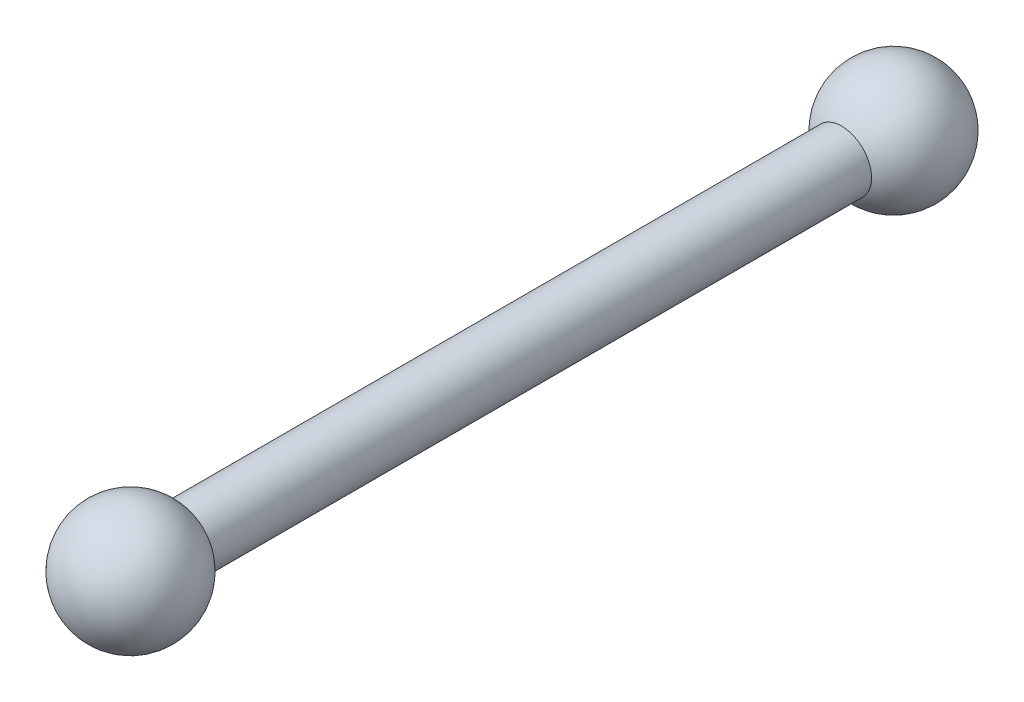
ISO-10303-21;
HEADER;
FILE_DESCRIPTION(('STEP AP214'),'2;1');
FILE_NAME('part.step','',(''),(''),'','','');
FILE_SCHEMA(('AUTOMOTIVE_DESIGN { 1 0 10303 214 1 1 1 1 }'));
ENDSEC;
DATA;
#1=APPLICATION_CONTEXT('core data for automotive mechanical design processes');
#2=APPLICATION_PROTOCOL_DEFINITION('international standard','automotive_design',2000,#1);
#3=PRODUCT_CONTEXT('',#1,'mechanical');
#4=PRODUCT('Part','Part','',(#3));
#5=PRODUCT_RELATED_PRODUCT_CATEGORY('part','',(#4));
#6=PRODUCT_DEFINITION_FORMATION('','',#4);
#7=PRODUCT_DEFINITION_CONTEXT('part definition',#1,'design');
#8=PRODUCT_DEFINITION('design','',#6,#7);
#9=PRODUCT_DEFINITION_SHAPE('','',#8);
#10=(LENGTH_UNIT() NAMED_UNIT(*) SI_UNIT(.MILLI.,.METRE.));
#11=(NAMED_UNIT(*) PLANE_ANGLE_UNIT() SI_UNIT($,.RADIAN.));
#12=(NAMED_UNIT(*) SI_UNIT($,.STERADIAN.) SOLID_ANGLE_UNIT());
#13=UNCERTAINTY_MEASURE_WITH_UNIT(LENGTH_MEASURE(1.E-05),#10,'distance_accuracy_value','');
#14=(GEOMETRIC_REPRESENTATION_CONTEXT(3) GLOBAL_UNCERTAINTY_ASSIGNED_CONTEXT((#13)) GLOBAL_UNIT_ASSIGNED_CONTEXT((#10,
#11,#12)) REPRESENTATION_CONTEXT('',''));
#15=CARTESIAN_POINT('',(0.,0.,0.));
#16=DIRECTION('',(0.,0.,1.));
#17=DIRECTION('',(1.,0.,0.));
#18=AXIS2_PLACEMENT_3D('',#15,#16,#17);
#19=CARTESIAN_POINT('',(0.,0.,-48.));
#20=DIRECTION('',(0.,1.,0.));
#21=DIRECTION('',(1.,0.,0.));
#22=AXIS2_PLACEMENT_3D('',#19,#20,#21);
#23=SPHERICAL_SURFACE('',#22,4.);
#24=CARTESIAN_POINT('',(0.,0.,-48.));
#25=DIRECTION('',(0.,0.,-1.));
#26=DIRECTION('',(-1.,0.,0.));
#27=AXIS2_PLACEMENT_3D('',#24,#25,#26);
#28=SPHERICAL_SURFACE('',#27,4.);
#29=CARTESIAN_POINT('',(0.,0.,-44.5358983848622));
#30=DIRECTION('',(0.,0.,-1.));
#31=DIRECTION('',(-1.,0.,0.));
#32=AXIS2_PLACEMENT_3D('',#29,#30,#31);
#33=CIRCLE('',#32,2.);
#34=CARTESIAN_POINT('',(-2.,0.,-44.5358983848622));
#35=VERTEX_POINT('',#34);
#36=EDGE_CURVE('E37',#35,#35,#33,.F.);
#37=ORIENTED_EDGE('',*,*,#36,.F.);
#38=EDGE_LOOP('',(#37));
#39=FACE_BOUND('',#38,.T.);
#40=ADVANCED_FACE('F33',(#39),#28,.T.);
#41=CARTESIAN_POINT('',(0.,0.,-45.));
#42=DIRECTION('',(0.,0.,1.));
#43=DIRECTION('',(1.,0.,0.));
#44=AXIS2_PLACEMENT_3D('',#41,#42,#43);
#45=CYLINDRICAL_SURFACE('',#44,2.);
#46=CARTESIAN_POINT('',(0.,0.,-0.464101615137766));
#47=DIRECTION('',(0.,0.,1.));
#48=DIRECTION('',(1.,0.,0.));
#49=AXIS2_PLACEMENT_3D('',#46,#47,#48);
#50=CIRCLE('',#49,2.);
#51=CARTESIAN_POINT('',(2.,0.,-0.464101615137766));
#52=VERTEX_POINT('',#51);
#53=EDGE_CURVE('E10',#52,#52,#50,.F.);
#54=ORIENTED_EDGE('',*,*,#53,.T.);
#55=EDGE_LOOP('',(#54));
#56=FACE_BOUND('',#55,.T.);
#57=ORIENTED_EDGE('',*,*,#36,.T.);
#58=EDGE_LOOP('',(#57));
#59=FACE_BOUND('',#58,.T.);
#60=ADVANCED_FACE('F35',(#56,#59),#45,.T.);
#61=CARTESIAN_POINT('',(0.,0.,3.));
#62=DIRECTION('',(0.,1.,0.));
#63=DIRECTION('',(1.,0.,0.));
#64=AXIS2_PLACEMENT_3D('',#61,#62,#63);
#65=SPHERICAL_SURFACE('',#64,4.);
#66=CARTESIAN_POINT('',(0.,0.,3.));
#67=DIRECTION('',(0.,0.,1.));
#68=DIRECTION('',(1.,0.,0.));
#69=AXIS2_PLACEMENT_3D('',#66,#67,#68);
#70=SPHERICAL_SURFACE('',#69,4.);
#71=ORIENTED_EDGE('',*,*,#53,.F.);
#72=EDGE_LOOP('',(#71));
#73=FACE_BOUND('',#72,.T.);
#74=ADVANCED_FACE('F52',(#73),#70,.T.);
#75=CLOSED_SHELL('',(#40,#60,#74));
#76=MANIFOLD_SOLID_BREP('B2',#75);
#77=ADVANCED_BREP_SHAPE_REPRESENTATION('',(#18,#76),#14);
#78=SHAPE_DEFINITION_REPRESENTATION(#9,#77);
ENDSEC;
END-ISO-10303-21;
